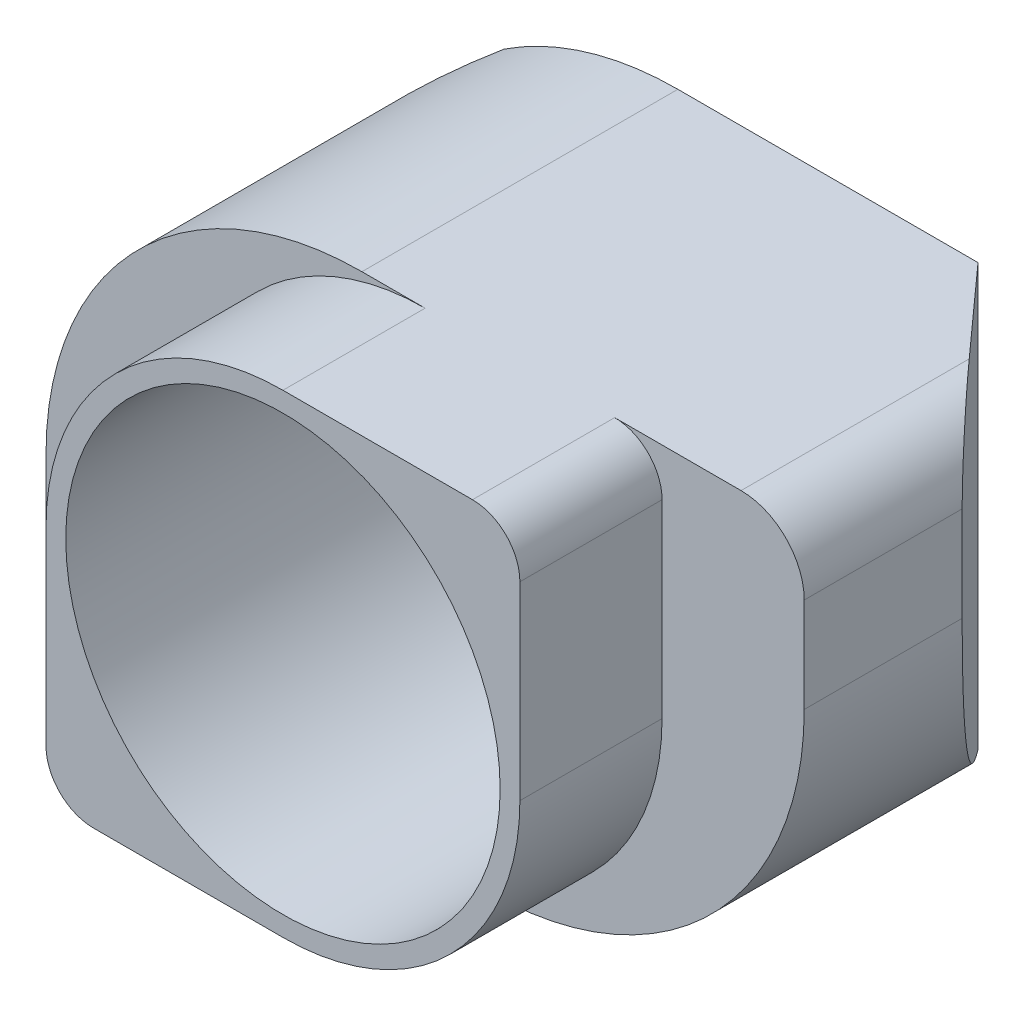
ISO-10303-21;
HEADER;
FILE_DESCRIPTION(('STEP AP214'),'2;1');
FILE_NAME('part.step','',(''),(''),'','','');
FILE_SCHEMA(('AUTOMOTIVE_DESIGN { 1 0 10303 214 1 1 1 1 }'));
ENDSEC;
DATA;
#1=APPLICATION_CONTEXT('core data for automotive mechanical design processes');
#2=APPLICATION_PROTOCOL_DEFINITION('international standard','automotive_design',2000,#1);
#3=PRODUCT_CONTEXT('',#1,'mechanical');
#4=PRODUCT('Part','Part','',(#3));
#5=PRODUCT_RELATED_PRODUCT_CATEGORY('part','',(#4));
#6=PRODUCT_DEFINITION_FORMATION('','',#4);
#7=PRODUCT_DEFINITION_CONTEXT('part definition',#1,'design');
#8=PRODUCT_DEFINITION('design','',#6,#7);
#9=PRODUCT_DEFINITION_SHAPE('','',#8);
#10=(LENGTH_UNIT() NAMED_UNIT(*) SI_UNIT(.MILLI.,.METRE.));
#11=(NAMED_UNIT(*) PLANE_ANGLE_UNIT() SI_UNIT($,.RADIAN.));
#12=(NAMED_UNIT(*) SI_UNIT($,.STERADIAN.) SOLID_ANGLE_UNIT());
#13=UNCERTAINTY_MEASURE_WITH_UNIT(LENGTH_MEASURE(1.E-05),#10,'distance_accuracy_value','');
#14=(GEOMETRIC_REPRESENTATION_CONTEXT(3) GLOBAL_UNCERTAINTY_ASSIGNED_CONTEXT((#13)) GLOBAL_UNIT_ASSIGNED_CONTEXT((#10,
#11,#12)) REPRESENTATION_CONTEXT('',''));
#15=CARTESIAN_POINT('',(0.,0.,0.));
#16=DIRECTION('',(0.,0.,1.));
#17=DIRECTION('',(1.,0.,0.));
#18=AXIS2_PLACEMENT_3D('',#15,#16,#17);
#19=CARTESIAN_POINT('',(0.,0.,4.));
#20=DIRECTION('',(0.,0.,1.));
#21=DIRECTION('',(1.,0.,0.));
#22=AXIS2_PLACEMENT_3D('',#19,#20,#21);
#23=PLANE('',#22);
#24=CARTESIAN_POINT('',(-4.,-2.2,4.));
#25=DIRECTION('',(0.,0.,-1.));
#26=DIRECTION('',(-0.707106781186548,-0.707106781186547,0.));
#27=AXIS2_PLACEMENT_3D('',#24,#25,#26);
#28=CIRCLE('',#27,0.8);
#29=CARTESIAN_POINT('',(-4.,-3.,4.));
#30=VERTEX_POINT('',#29);
#31=CARTESIAN_POINT('',(-4.8,-2.2,4.));
#32=VERTEX_POINT('',#31);
#33=EDGE_CURVE('E287',#30,#32,#28,.T.);
#34=ORIENTED_EDGE('',*,*,#33,.F.);
#35=DIRECTION('',(1.,0.,0.));
#36=VECTOR('',#35,1.);
#37=CARTESIAN_POINT('',(-4.8,-3.,4.));
#38=LINE('',#37,#36);
#39=CARTESIAN_POINT('',(-2.4,-3.,4.));
#40=VERTEX_POINT('',#39);
#41=EDGE_CURVE('E255',#30,#40,#38,.T.);
#42=ORIENTED_EDGE('',*,*,#41,.T.);
#43=CARTESIAN_POINT('',(-2.4,-2.4,4.));
#44=DIRECTION('',(0.,0.,1.));
#45=DIRECTION('',(-0.707106781186548,-0.707106781186547,0.));
#46=AXIS2_PLACEMENT_3D('',#43,#44,#45);
#47=CIRCLE('',#46,0.6);
#48=CARTESIAN_POINT('',(-3.,-2.4,4.));
#49=VERTEX_POINT('',#48);
#50=EDGE_CURVE('E256',#49,#40,#47,.T.);
#51=ORIENTED_EDGE('',*,*,#50,.F.);
#52=DIRECTION('',(0.,1.,0.));
#53=VECTOR('',#52,1.);
#54=CARTESIAN_POINT('',(-3.,0.,4.));
#55=LINE('',#54,#53);
#56=CARTESIAN_POINT('',(-3.,0.,4.));
#57=VERTEX_POINT('',#56);
#58=EDGE_CURVE('E50',#49,#57,#55,.T.);
#59=ORIENTED_EDGE('',*,*,#58,.T.);
#60=CARTESIAN_POINT('',(0.,0.,4.));
#61=DIRECTION('',(0.,0.,-1.));
#62=DIRECTION('',(-1.,0.,0.));
#63=AXIS2_PLACEMENT_3D('',#60,#61,#62);
#64=CIRCLE('',#63,3.);
#65=CARTESIAN_POINT('',(0.,3.,4.));
#66=VERTEX_POINT('',#65);
#67=EDGE_CURVE('E11',#57,#66,#64,.T.);
#68=ORIENTED_EDGE('',*,*,#67,.T.);
#69=DIRECTION('',(-1.,0.,0.));
#70=VECTOR('',#69,1.);
#71=CARTESIAN_POINT('',(4.8,3.,4.));
#72=LINE('',#71,#70);
#73=CARTESIAN_POINT('',(-0.8,3.,4.));
#74=VERTEX_POINT('',#73);
#75=EDGE_CURVE('E298',#66,#74,#72,.T.);
#76=ORIENTED_EDGE('',*,*,#75,.T.);
#77=CARTESIAN_POINT('',(-0.8,-1.,4.));
#78=DIRECTION('',(0.,0.,-1.));
#79=DIRECTION('',(-0.707106781186548,0.707106781186548,0.));
#80=AXIS2_PLACEMENT_3D('',#77,#78,#79);
#81=CIRCLE('',#80,4.);
#82=CARTESIAN_POINT('',(-4.8,-1.,4.));
#83=VERTEX_POINT('',#82);
#84=EDGE_CURVE('E306',#83,#74,#81,.T.);
#85=ORIENTED_EDGE('',*,*,#84,.F.);
#86=DIRECTION('',(0.,-1.,0.));
#87=VECTOR('',#86,1.);
#88=CARTESIAN_POINT('',(-4.8,3.,4.));
#89=LINE('',#88,#87);
#90=EDGE_CURVE('E269',#83,#32,#89,.T.);
#91=ORIENTED_EDGE('',*,*,#90,.T.);
#92=EDGE_LOOP('',(#34,#42,#51,#59,#68,#76,#85,#91));
#93=FACE_BOUND('',#92,.T.);
#94=ADVANCED_FACE('F40',(#93),#23,.T.);
#95=CARTESIAN_POINT('',(0.,0.,4.));
#96=DIRECTION('',(0.,0.,1.));
#97=DIRECTION('',(-1.,0.,0.));
#98=AXIS2_PLACEMENT_3D('',#95,#96,#97);
#99=CYLINDRICAL_SURFACE('',#98,3.);
#100=CARTESIAN_POINT('',(0.,0.,4.));
#101=DIRECTION('',(0.,0.,-1.));
#102=DIRECTION('',(-1.,0.,0.));
#103=AXIS2_PLACEMENT_3D('',#100,#101,#102);
#104=CIRCLE('',#103,3.);
#105=CARTESIAN_POINT('',(3.,0.,4.));
#106=VERTEX_POINT('',#105);
#107=CARTESIAN_POINT('',(0.,-3.,4.));
#108=VERTEX_POINT('',#107);
#109=EDGE_CURVE('E195',#106,#108,#104,.T.);
#110=ORIENTED_EDGE('',*,*,#109,.F.);
#111=DIRECTION('',(0.,0.,1.));
#112=VECTOR('',#111,1.);
#113=CARTESIAN_POINT('',(3.,0.,4.));
#114=LINE('',#113,#112);
#115=CARTESIAN_POINT('',(3.,0.,5.8));
#116=VERTEX_POINT('',#115);
#117=EDGE_CURVE('E262',#106,#116,#114,.T.);
#118=ORIENTED_EDGE('',*,*,#117,.T.);
#119=CARTESIAN_POINT('',(0.,0.,5.8));
#120=DIRECTION('',(0.,0.,1.));
#121=DIRECTION('',(-1.,0.,0.));
#122=AXIS2_PLACEMENT_3D('',#119,#120,#121);
#123=CIRCLE('',#122,3.);
#124=CARTESIAN_POINT('',(0.,-3.,5.8));
#125=VERTEX_POINT('',#124);
#126=EDGE_CURVE('E278',#125,#116,#123,.T.);
#127=ORIENTED_EDGE('',*,*,#126,.F.);
#128=DIRECTION('',(0.,0.,1.));
#129=VECTOR('',#128,1.);
#130=CARTESIAN_POINT('',(0.,-3.,4.));
#131=LINE('',#130,#129);
#132=EDGE_CURVE('E43',#108,#125,#131,.T.);
#133=ORIENTED_EDGE('',*,*,#132,.F.);
#134=EDGE_LOOP('',(#110,#118,#127,#133));
#135=FACE_BOUND('',#134,.T.);
#136=ADVANCED_FACE('F351',(#135),#99,.T.);
#137=CARTESIAN_POINT('',(0.,0.,4.));
#138=DIRECTION('',(0.,0.,1.));
#139=DIRECTION('',(-1.,0.,0.));
#140=AXIS2_PLACEMENT_3D('',#137,#138,#139);
#141=CYLINDRICAL_SURFACE('',#140,3.);
#142=ORIENTED_EDGE('',*,*,#67,.F.);
#143=DIRECTION('',(0.,0.,1.));
#144=VECTOR('',#143,1.);
#145=CARTESIAN_POINT('',(-3.,0.,4.));
#146=LINE('',#145,#144);
#147=CARTESIAN_POINT('',(-3.,0.,5.8));
#148=VERTEX_POINT('',#147);
#149=EDGE_CURVE('E300',#57,#148,#146,.T.);
#150=ORIENTED_EDGE('',*,*,#149,.T.);
#151=CARTESIAN_POINT('',(0.,0.,5.8));
#152=DIRECTION('',(0.,0.,1.));
#153=DIRECTION('',(-1.,0.,0.));
#154=AXIS2_PLACEMENT_3D('',#151,#152,#153);
#155=CIRCLE('',#154,3.);
#156=CARTESIAN_POINT('',(0.,3.,5.8));
#157=VERTEX_POINT('',#156);
#158=EDGE_CURVE('E236',#157,#148,#155,.T.);
#159=ORIENTED_EDGE('',*,*,#158,.F.);
#160=DIRECTION('',(0.,0.,1.));
#161=VECTOR('',#160,1.);
#162=CARTESIAN_POINT('',(0.,3.,4.));
#163=LINE('',#162,#161);
#164=EDGE_CURVE('E303',#66,#157,#163,.T.);
#165=ORIENTED_EDGE('',*,*,#164,.F.);
#166=EDGE_LOOP('',(#142,#150,#159,#165));
#167=FACE_BOUND('',#166,.T.);
#168=ADVANCED_FACE('F447',(#167),#141,.T.);
#169=CARTESIAN_POINT('',(-3.,0.,4.));
#170=DIRECTION('',(-1.,0.,0.));
#171=DIRECTION('',(0.,0.,1.));
#172=AXIS2_PLACEMENT_3D('',#169,#170,#171);
#173=PLANE('',#172);
#174=DIRECTION('',(0.,0.,-1.));
#175=VECTOR('',#174,1.);
#176=CARTESIAN_POINT('',(-3.,-2.4,2.));
#177=LINE('',#176,#175);
#178=CARTESIAN_POINT('',(-3.,-2.4,5.8));
#179=VERTEX_POINT('',#178);
#180=EDGE_CURVE('E274',#179,#49,#177,.T.);
#181=ORIENTED_EDGE('',*,*,#180,.F.);
#182=DIRECTION('',(0.,-1.,0.));
#183=VECTOR('',#182,1.);
#184=CARTESIAN_POINT('',(-3.,0.,5.8));
#185=LINE('',#184,#183);
#186=EDGE_CURVE('E323',#148,#179,#185,.T.);
#187=ORIENTED_EDGE('',*,*,#186,.F.);
#188=ORIENTED_EDGE('',*,*,#149,.F.);
#189=ORIENTED_EDGE('',*,*,#58,.F.);
#190=EDGE_LOOP('',(#181,#187,#188,#189));
#191=FACE_BOUND('',#190,.T.);
#192=ADVANCED_FACE('F445',(#191),#173,.T.);
#193=CARTESIAN_POINT('',(-4.8,3.,0.));
#194=DIRECTION('',(-1.,0.,0.));
#195=DIRECTION('',(0.,0.,1.));
#196=AXIS2_PLACEMENT_3D('',#193,#194,#195);
#197=PLANE('',#196);
#198=DIRECTION('',(0.,0.,-1.));
#199=VECTOR('',#198,1.);
#200=CARTESIAN_POINT('',(-4.8,-2.2,0.));
#201=LINE('',#200,#199);
#202=CARTESIAN_POINT('',(-4.8,-2.2,2.));
#203=VERTEX_POINT('',#202);
#204=EDGE_CURVE('E250',#32,#203,#201,.T.);
#205=ORIENTED_EDGE('',*,*,#204,.F.);
#206=ORIENTED_EDGE('',*,*,#90,.F.);
#207=DIRECTION('',(0.,0.,1.));
#208=VECTOR('',#207,1.);
#209=CARTESIAN_POINT('',(-4.8,-1.,0.));
#210=LINE('',#209,#208);
#211=CARTESIAN_POINT('',(-4.8,-1.,2.));
#212=VERTEX_POINT('',#211);
#213=EDGE_CURVE('E261',#212,#83,#210,.T.);
#214=ORIENTED_EDGE('',*,*,#213,.F.);
#215=DIRECTION('',(0.,-1.,0.));
#216=VECTOR('',#215,1.);
#217=CARTESIAN_POINT('',(-4.8,0.,2.));
#218=LINE('',#217,#216);
#219=EDGE_CURVE('E249',#212,#203,#218,.T.);
#220=ORIENTED_EDGE('',*,*,#219,.T.);
#221=EDGE_LOOP('',(#205,#206,#214,#220));
#222=FACE_BOUND('',#221,.T.);
#223=ADVANCED_FACE('F482',(#222),#197,.T.);
#224=CARTESIAN_POINT('',(3.,-3.,0.));
#225=DIRECTION('',(-0.743294146247166,0.,0.66896473162245));
#226=DIRECTION('',(0.,1.,0.));
#227=AXIS2_PLACEMENT_3D('',#224,#225,#226);
#228=PLANE('',#227);
#229=CARTESIAN_POINT('',(4.,2.2,1.11111111111111));
#230=DIRECTION('',(-0.743294146247166,0.,0.66896473162245));
#231=DIRECTION('',(0.66896473162245,0.,0.743294146247166));
#232=AXIS2_PLACEMENT_3D('',#229,#230,#231);
#233=ELLIPSE('',#232,1.19587769307322,0.8);
#234=CARTESIAN_POINT('',(4.8,2.2,2.));
#235=VERTEX_POINT('',#234);
#236=CARTESIAN_POINT('',(4.,3.,1.11111111111111));
#237=VERTEX_POINT('',#236);
#238=EDGE_CURVE('E203',#235,#237,#233,.T.);
#239=ORIENTED_EDGE('',*,*,#238,.F.);
#240=DIRECTION('',(0.,1.,0.));
#241=VECTOR('',#240,1.);
#242=CARTESIAN_POINT('',(4.8,-3.,2.));
#243=LINE('',#242,#241);
#244=CARTESIAN_POINT('',(4.8,1.,2.));
#245=VERTEX_POINT('',#244);
#246=EDGE_CURVE('E266',#245,#235,#243,.T.);
#247=ORIENTED_EDGE('',*,*,#246,.F.);
#248=CARTESIAN_POINT('',(0.8,1.,-2.44444444444445));
#249=DIRECTION('',(-0.743294146247166,0.,0.66896473162245));
#250=DIRECTION('',(0.66896473162245,0.,0.743294146247166));
#251=AXIS2_PLACEMENT_3D('',#248,#249,#250);
#252=ELLIPSE('',#251,5.97938846536609,4.);
#253=CARTESIAN_POINT('',(3.,-2.34065861769801,0.));
#254=VERTEX_POINT('',#253);
#255=EDGE_CURVE('E240',#254,#245,#252,.T.);
#256=ORIENTED_EDGE('',*,*,#255,.F.);
#257=DIRECTION('',(0.,-1.,0.));
#258=VECTOR('',#257,1.);
#259=CARTESIAN_POINT('',(3.,-1.5,0.));
#260=LINE('',#259,#258);
#261=CARTESIAN_POINT('',(3.,3.,0.));
#262=VERTEX_POINT('',#261);
#263=EDGE_CURVE('E257',#262,#254,#260,.T.);
#264=ORIENTED_EDGE('',*,*,#263,.F.);
#265=DIRECTION('',(-0.66896473162245,0.,-0.743294146247166));
#266=VECTOR('',#265,1.);
#267=CARTESIAN_POINT('',(3.40276243093923,3.,0.447513812154696));
#268=LINE('',#267,#266);
#269=EDGE_CURVE('E393',#237,#262,#268,.T.);
#270=ORIENTED_EDGE('',*,*,#269,.F.);
#271=EDGE_LOOP('',(#239,#247,#256,#264,#270));
#272=FACE_BOUND('',#271,.T.);
#273=ADVANCED_FACE('F477',(#272),#228,.F.);
#274=CARTESIAN_POINT('',(4.8,-3.,0.));
#275=DIRECTION('',(1.,0.,0.));
#276=DIRECTION('',(0.,1.,0.));
#277=AXIS2_PLACEMENT_3D('',#274,#275,#276);
#278=PLANE('',#277);
#279=DIRECTION('',(0.,0.,-1.));
#280=VECTOR('',#279,1.);
#281=CARTESIAN_POINT('',(4.8,2.2,0.));
#282=LINE('',#281,#280);
#283=CARTESIAN_POINT('',(4.8,2.2,4.));
#284=VERTEX_POINT('',#283);
#285=EDGE_CURVE('E212',#284,#235,#282,.T.);
#286=ORIENTED_EDGE('',*,*,#285,.F.);
#287=DIRECTION('',(0.,1.,0.));
#288=VECTOR('',#287,1.);
#289=CARTESIAN_POINT('',(4.8,-3.,4.));
#290=LINE('',#289,#288);
#291=CARTESIAN_POINT('',(4.8,1.,4.));
#292=VERTEX_POINT('',#291);
#293=EDGE_CURVE('E209',#292,#284,#290,.T.);
#294=ORIENTED_EDGE('',*,*,#293,.F.);
#295=DIRECTION('',(0.,0.,1.));
#296=VECTOR('',#295,1.);
#297=CARTESIAN_POINT('',(4.8,1.,0.));
#298=LINE('',#297,#296);
#299=EDGE_CURVE('E244',#245,#292,#298,.T.);
#300=ORIENTED_EDGE('',*,*,#299,.F.);
#301=ORIENTED_EDGE('',*,*,#246,.T.);
#302=EDGE_LOOP('',(#286,#294,#300,#301));
#303=FACE_BOUND('',#302,.T.);
#304=ADVANCED_FACE('F392',(#303),#278,.T.);
#305=CARTESIAN_POINT('',(0.8,1.,0.));
#306=DIRECTION('',(0.,0.,1.));
#307=DIRECTION('',(0.707106781186548,-0.707106781186548,0.));
#308=AXIS2_PLACEMENT_3D('',#305,#306,#307);
#309=CYLINDRICAL_SURFACE('',#308,4.);
#310=CARTESIAN_POINT('',(0.8,1.,4.));
#311=DIRECTION('',(0.,0.,-1.));
#312=DIRECTION('',(0.707106781186548,-0.707106781186548,0.));
#313=AXIS2_PLACEMENT_3D('',#310,#311,#312);
#314=CIRCLE('',#313,4.);
#315=CARTESIAN_POINT('',(0.8,-3.,4.));
#316=VERTEX_POINT('',#315);
#317=EDGE_CURVE('E237',#292,#316,#314,.T.);
#318=ORIENTED_EDGE('',*,*,#317,.T.);
#319=DIRECTION('',(0.,0.,-1.));
#320=VECTOR('',#319,1.);
#321=CARTESIAN_POINT('',(0.8,-3.,0.));
#322=LINE('',#321,#320);
#323=CARTESIAN_POINT('',(0.8,-3.,0.));
#324=VERTEX_POINT('',#323);
#325=EDGE_CURVE('E311',#316,#324,#322,.T.);
#326=ORIENTED_EDGE('',*,*,#325,.T.);
#327=CARTESIAN_POINT('',(0.8,1.,0.));
#328=DIRECTION('',(0.,0.,1.));
#329=DIRECTION('',(0.707106781186548,-0.707106781186548,0.));
#330=AXIS2_PLACEMENT_3D('',#327,#328,#329);
#331=CIRCLE('',#330,4.);
#332=EDGE_CURVE('E245',#324,#254,#331,.T.);
#333=ORIENTED_EDGE('',*,*,#332,.T.);
#334=ORIENTED_EDGE('',*,*,#255,.T.);
#335=ORIENTED_EDGE('',*,*,#299,.T.);
#336=EDGE_LOOP('',(#318,#326,#333,#334,#335));
#337=FACE_BOUND('',#336,.T.);
#338=ADVANCED_FACE('F389',(#337),#309,.T.);
#339=CARTESIAN_POINT('',(0.,0.,0.));
#340=DIRECTION('',(0.,0.,1.));
#341=DIRECTION('',(1.,0.,0.));
#342=AXIS2_PLACEMENT_3D('',#339,#340,#341);
#343=PLANE('',#342);
#344=CARTESIAN_POINT('',(0.,0.,0.));
#345=DIRECTION('',(0.,0.,1.));
#346=DIRECTION('',(1.,0.,0.));
#347=AXIS2_PLACEMENT_3D('',#344,#345,#346);
#348=CIRCLE('',#347,2.75);
#349=CARTESIAN_POINT('',(2.75,0.,0.));
#350=VERTEX_POINT('',#349);
#351=EDGE_CURVE('E231',#350,#350,#348,.T.);
#352=ORIENTED_EDGE('',*,*,#351,.T.);
#353=EDGE_LOOP('',(#352));
#354=FACE_BOUND('',#353,.T.);
#355=CARTESIAN_POINT('',(-0.8,-1.,0.));
#356=DIRECTION('',(0.,0.,1.));
#357=DIRECTION('',(-0.707106781186548,0.707106781186548,0.));
#358=AXIS2_PLACEMENT_3D('',#355,#356,#357);
#359=CIRCLE('',#358,4.);
#360=CARTESIAN_POINT('',(-0.8,3.,0.));
#361=VERTEX_POINT('',#360);
#362=CARTESIAN_POINT('',(-3.,2.34065861769801,0.));
#363=VERTEX_POINT('',#362);
#364=EDGE_CURVE('E410',#361,#363,#359,.T.);
#365=ORIENTED_EDGE('',*,*,#364,.F.);
#366=DIRECTION('',(-1.,0.,0.));
#367=VECTOR('',#366,1.);
#368=CARTESIAN_POINT('',(4.8,3.,0.));
#369=LINE('',#368,#367);
#370=EDGE_CURVE('E299',#262,#361,#369,.T.);
#371=ORIENTED_EDGE('',*,*,#370,.F.);
#372=ORIENTED_EDGE('',*,*,#263,.T.);
#373=ORIENTED_EDGE('',*,*,#332,.F.);
#374=DIRECTION('',(1.,0.,0.));
#375=VECTOR('',#374,1.);
#376=CARTESIAN_POINT('',(-4.8,-3.,0.));
#377=LINE('',#376,#375);
#378=CARTESIAN_POINT('',(-3.,-3.,0.));
#379=VERTEX_POINT('',#378);
#380=EDGE_CURVE('E307',#379,#324,#377,.T.);
#381=ORIENTED_EDGE('',*,*,#380,.F.);
#382=DIRECTION('',(0.,1.,0.));
#383=VECTOR('',#382,1.);
#384=CARTESIAN_POINT('',(-3.,-1.5,0.));
#385=LINE('',#384,#383);
#386=EDGE_CURVE('E213',#379,#363,#385,.T.);
#387=ORIENTED_EDGE('',*,*,#386,.T.);
#388=EDGE_LOOP('',(#365,#371,#372,#373,#381,#387));
#389=FACE_BOUND('',#388,.T.);
#390=ADVANCED_FACE('F385',(#354,#389),#343,.F.);
#391=CARTESIAN_POINT('',(-0.8,-1.,0.));
#392=DIRECTION('',(0.,0.,1.));
#393=DIRECTION('',(-0.707106781186548,0.707106781186548,0.));
#394=AXIS2_PLACEMENT_3D('',#391,#392,#393);
#395=CYLINDRICAL_SURFACE('',#394,4.);
#396=ORIENTED_EDGE('',*,*,#84,.T.);
#397=DIRECTION('',(0.,0.,-1.));
#398=VECTOR('',#397,1.);
#399=CARTESIAN_POINT('',(-0.8,3.,0.));
#400=LINE('',#399,#398);
#401=EDGE_CURVE('E294',#74,#361,#400,.T.);
#402=ORIENTED_EDGE('',*,*,#401,.T.);
#403=ORIENTED_EDGE('',*,*,#364,.T.);
#404=CARTESIAN_POINT('',(-0.8,-1.,-2.44444444444445));
#405=DIRECTION('',(0.743294146247166,0.,0.66896473162245));
#406=DIRECTION('',(-0.66896473162245,0.,0.743294146247166));
#407=AXIS2_PLACEMENT_3D('',#404,#405,#406);
#408=ELLIPSE('',#407,5.97938846536609,4.);
#409=EDGE_CURVE('E220',#363,#212,#408,.T.);
#410=ORIENTED_EDGE('',*,*,#409,.T.);
#411=ORIENTED_EDGE('',*,*,#213,.T.);
#412=EDGE_LOOP('',(#396,#402,#403,#410,#411));
#413=FACE_BOUND('',#412,.T.);
#414=ADVANCED_FACE('F416',(#413),#395,.T.);
#415=CARTESIAN_POINT('',(4.8,3.,0.));
#416=DIRECTION('',(0.,1.,0.));
#417=DIRECTION('',(1.,0.,0.));
#418=AXIS2_PLACEMENT_3D('',#415,#416,#417);
#419=PLANE('',#418);
#420=DIRECTION('',(-1.,0.,0.));
#421=VECTOR('',#420,1.);
#422=CARTESIAN_POINT('',(4.8,3.,4.));
#423=LINE('',#422,#421);
#424=CARTESIAN_POINT('',(4.,3.,4.));
#425=VERTEX_POINT('',#424);
#426=CARTESIAN_POINT('',(2.4,3.,4.));
#427=VERTEX_POINT('',#426);
#428=EDGE_CURVE('E178',#425,#427,#423,.T.);
#429=ORIENTED_EDGE('',*,*,#428,.F.);
#430=DIRECTION('',(0.,0.,1.));
#431=VECTOR('',#430,1.);
#432=CARTESIAN_POINT('',(4.,3.,0.));
#433=LINE('',#432,#431);
#434=EDGE_CURVE('E189',#237,#425,#433,.T.);
#435=ORIENTED_EDGE('',*,*,#434,.F.);
#436=ORIENTED_EDGE('',*,*,#269,.T.);
#437=ORIENTED_EDGE('',*,*,#370,.T.);
#438=ORIENTED_EDGE('',*,*,#401,.F.);
#439=ORIENTED_EDGE('',*,*,#75,.F.);
#440=ORIENTED_EDGE('',*,*,#164,.T.);
#441=DIRECTION('',(-1.,0.,0.));
#442=VECTOR('',#441,1.);
#443=CARTESIAN_POINT('',(3.,3.,5.8));
#444=LINE('',#443,#442);
#445=CARTESIAN_POINT('',(2.4,3.,5.8));
#446=VERTEX_POINT('',#445);
#447=EDGE_CURVE('E232',#446,#157,#444,.T.);
#448=ORIENTED_EDGE('',*,*,#447,.F.);
#449=DIRECTION('',(0.,0.,1.));
#450=VECTOR('',#449,1.);
#451=CARTESIAN_POINT('',(2.4,3.,2.));
#452=LINE('',#451,#450);
#453=EDGE_CURVE('E192',#427,#446,#452,.T.);
#454=ORIENTED_EDGE('',*,*,#453,.F.);
#455=EDGE_LOOP('',(#429,#435,#436,#437,#438,#439,#440,#448,#454));
#456=FACE_BOUND('',#455,.T.);
#457=ADVANCED_FACE('F187',(#456),#419,.T.);
#458=CARTESIAN_POINT('',(0.,0.,4.));
#459=DIRECTION('',(0.,0.,1.));
#460=DIRECTION('',(1.,0.,0.));
#461=AXIS2_PLACEMENT_3D('',#458,#459,#460);
#462=PLANE('',#461);
#463=CARTESIAN_POINT('',(4.,2.2,4.));
#464=DIRECTION('',(0.,0.,-1.));
#465=DIRECTION('',(0.707106781186548,0.707106781186547,0.));
#466=AXIS2_PLACEMENT_3D('',#463,#464,#465);
#467=CIRCLE('',#466,0.8);
#468=EDGE_CURVE('E201',#425,#284,#467,.T.);
#469=ORIENTED_EDGE('',*,*,#468,.F.);
#470=ORIENTED_EDGE('',*,*,#428,.T.);
#471=CARTESIAN_POINT('',(2.4,2.4,4.));
#472=DIRECTION('',(0.,0.,1.));
#473=DIRECTION('',(0.707106781186548,0.707106781186547,0.));
#474=AXIS2_PLACEMENT_3D('',#471,#472,#473);
#475=CIRCLE('',#474,0.6);
#476=CARTESIAN_POINT('',(3.,2.4,4.));
#477=VERTEX_POINT('',#476);
#478=EDGE_CURVE('E315',#477,#427,#475,.T.);
#479=ORIENTED_EDGE('',*,*,#478,.F.);
#480=DIRECTION('',(0.,-1.,0.));
#481=VECTOR('',#480,1.);
#482=CARTESIAN_POINT('',(3.,0.,4.));
#483=LINE('',#482,#481);
#484=EDGE_CURVE('E169',#477,#106,#483,.T.);
#485=ORIENTED_EDGE('',*,*,#484,.T.);
#486=ORIENTED_EDGE('',*,*,#109,.T.);
#487=DIRECTION('',(1.,0.,0.));
#488=VECTOR('',#487,1.);
#489=CARTESIAN_POINT('',(-4.8,-3.,4.));
#490=LINE('',#489,#488);
#491=EDGE_CURVE('E357',#108,#316,#490,.T.);
#492=ORIENTED_EDGE('',*,*,#491,.T.);
#493=ORIENTED_EDGE('',*,*,#317,.F.);
#494=ORIENTED_EDGE('',*,*,#293,.T.);
#495=EDGE_LOOP('',(#469,#470,#479,#485,#486,#492,#493,#494));
#496=FACE_BOUND('',#495,.T.);
#497=ADVANCED_FACE('F206',(#496),#462,.T.);
#498=CARTESIAN_POINT('',(4.,2.2,0.));
#499=DIRECTION('',(0.,0.,1.));
#500=DIRECTION('',(0.707106781186548,0.707106781186547,0.));
#501=AXIS2_PLACEMENT_3D('',#498,#499,#500);
#502=CYLINDRICAL_SURFACE('',#501,0.8);
#503=ORIENTED_EDGE('',*,*,#468,.T.);
#504=ORIENTED_EDGE('',*,*,#285,.T.);
#505=ORIENTED_EDGE('',*,*,#238,.T.);
#506=ORIENTED_EDGE('',*,*,#434,.T.);
#507=EDGE_LOOP('',(#503,#504,#505,#506));
#508=FACE_BOUND('',#507,.T.);
#509=ADVANCED_FACE('F199',(#508),#502,.T.);
#510=CARTESIAN_POINT('',(-4.8,-3.,2.));
#511=DIRECTION('',(0.743294146247166,0.,0.66896473162245));
#512=DIRECTION('',(0.,-1.,0.));
#513=AXIS2_PLACEMENT_3D('',#510,#511,#512);
#514=PLANE('',#513);
#515=CARTESIAN_POINT('',(-4.,-2.2,1.11111111111111));
#516=DIRECTION('',(0.743294146247166,0.,0.66896473162245));
#517=DIRECTION('',(-0.66896473162245,0.,0.743294146247166));
#518=AXIS2_PLACEMENT_3D('',#515,#516,#517);
#519=ELLIPSE('',#518,1.19587769307322,0.8);
#520=CARTESIAN_POINT('',(-4.,-3.,1.11111111111111));
#521=VERTEX_POINT('',#520);
#522=EDGE_CURVE('E246',#203,#521,#519,.T.);
#523=ORIENTED_EDGE('',*,*,#522,.F.);
#524=ORIENTED_EDGE('',*,*,#219,.F.);
#525=ORIENTED_EDGE('',*,*,#409,.F.);
#526=ORIENTED_EDGE('',*,*,#386,.F.);
#527=DIRECTION('',(0.66896473162245,0.,-0.743294146247166));
#528=VECTOR('',#527,1.);
#529=CARTESIAN_POINT('',(-4.30276243093923,-3.,1.4475138121547));
#530=LINE('',#529,#528);
#531=EDGE_CURVE('E282',#521,#379,#530,.T.);
#532=ORIENTED_EDGE('',*,*,#531,.F.);
#533=EDGE_LOOP('',(#523,#524,#525,#526,#532));
#534=FACE_BOUND('',#533,.T.);
#535=ADVANCED_FACE('F379',(#534),#514,.F.);
#536=CARTESIAN_POINT('',(-4.,-2.2,0.));
#537=DIRECTION('',(0.,0.,1.));
#538=DIRECTION('',(-0.707106781186548,-0.707106781186547,0.));
#539=AXIS2_PLACEMENT_3D('',#536,#537,#538);
#540=CYLINDRICAL_SURFACE('',#539,0.8);
#541=ORIENTED_EDGE('',*,*,#33,.T.);
#542=ORIENTED_EDGE('',*,*,#204,.T.);
#543=ORIENTED_EDGE('',*,*,#522,.T.);
#544=DIRECTION('',(0.,0.,1.));
#545=VECTOR('',#544,1.);
#546=CARTESIAN_POINT('',(-4.,-3.,0.));
#547=LINE('',#546,#545);
#548=EDGE_CURVE('E279',#521,#30,#547,.T.);
#549=ORIENTED_EDGE('',*,*,#548,.T.);
#550=EDGE_LOOP('',(#541,#542,#543,#549));
#551=FACE_BOUND('',#550,.T.);
#552=ADVANCED_FACE('F438',(#551),#540,.T.);
#553=CARTESIAN_POINT('',(-4.8,-3.,0.));
#554=DIRECTION('',(0.,-1.,0.));
#555=DIRECTION('',(0.,0.,-1.));
#556=AXIS2_PLACEMENT_3D('',#553,#554,#555);
#557=PLANE('',#556);
#558=DIRECTION('',(0.,0.,1.));
#559=VECTOR('',#558,1.);
#560=CARTESIAN_POINT('',(-2.4,-3.,2.));
#561=LINE('',#560,#559);
#562=CARTESIAN_POINT('',(-2.4,-3.,5.8));
#563=VERTEX_POINT('',#562);
#564=EDGE_CURVE('E251',#40,#563,#561,.T.);
#565=ORIENTED_EDGE('',*,*,#564,.F.);
#566=ORIENTED_EDGE('',*,*,#41,.F.);
#567=ORIENTED_EDGE('',*,*,#548,.F.);
#568=ORIENTED_EDGE('',*,*,#531,.T.);
#569=ORIENTED_EDGE('',*,*,#380,.T.);
#570=ORIENTED_EDGE('',*,*,#325,.F.);
#571=ORIENTED_EDGE('',*,*,#491,.F.);
#572=ORIENTED_EDGE('',*,*,#132,.T.);
#573=DIRECTION('',(1.,0.,0.));
#574=VECTOR('',#573,1.);
#575=CARTESIAN_POINT('',(-3.,-3.,5.8));
#576=LINE('',#575,#574);
#577=EDGE_CURVE('E336',#563,#125,#576,.T.);
#578=ORIENTED_EDGE('',*,*,#577,.F.);
#579=EDGE_LOOP('',(#565,#566,#567,#568,#569,#570,#571,#572,#578));
#580=FACE_BOUND('',#579,.T.);
#581=ADVANCED_FACE('F360',(#580),#557,.T.);
#582=CARTESIAN_POINT('',(-2.4,-2.4,2.));
#583=DIRECTION('',(0.,0.,1.));
#584=DIRECTION('',(-0.707106781186548,-0.707106781186547,0.));
#585=AXIS2_PLACEMENT_3D('',#582,#583,#584);
#586=CYLINDRICAL_SURFACE('',#585,0.6);
#587=CARTESIAN_POINT('',(-2.4,-2.4,5.8));
#588=DIRECTION('',(0.,0.,-1.));
#589=DIRECTION('',(-0.707106781186548,-0.707106781186547,0.));
#590=AXIS2_PLACEMENT_3D('',#587,#588,#589);
#591=CIRCLE('',#590,0.6);
#592=EDGE_CURVE('E332',#563,#179,#591,.T.);
#593=ORIENTED_EDGE('',*,*,#592,.T.);
#594=ORIENTED_EDGE('',*,*,#180,.T.);
#595=ORIENTED_EDGE('',*,*,#50,.T.);
#596=ORIENTED_EDGE('',*,*,#564,.T.);
#597=EDGE_LOOP('',(#593,#594,#595,#596));
#598=FACE_BOUND('',#597,.T.);
#599=ADVANCED_FACE('F441',(#598),#586,.T.);
#600=CARTESIAN_POINT('',(0.,0.,5.8));
#601=DIRECTION('',(0.,0.,1.));
#602=DIRECTION('',(1.,0.,0.));
#603=AXIS2_PLACEMENT_3D('',#600,#601,#602);
#604=PLANE('',#603);
#605=CARTESIAN_POINT('',(0.,0.,5.8));
#606=DIRECTION('',(0.,0.,1.));
#607=DIRECTION('',(1.,0.,0.));
#608=AXIS2_PLACEMENT_3D('',#605,#606,#607);
#609=CIRCLE('',#608,2.75);
#610=CARTESIAN_POINT('',(2.75,0.,5.8));
#611=VERTEX_POINT('',#610);
#612=EDGE_CURVE('E508',#611,#611,#609,.T.);
#613=ORIENTED_EDGE('',*,*,#612,.F.);
#614=EDGE_LOOP('',(#613));
#615=FACE_BOUND('',#614,.T.);
#616=CARTESIAN_POINT('',(2.4,2.4,5.8));
#617=DIRECTION('',(0.,0.,-1.));
#618=DIRECTION('',(0.707106781186548,0.707106781186547,0.));
#619=AXIS2_PLACEMENT_3D('',#616,#617,#618);
#620=CIRCLE('',#619,0.6);
#621=CARTESIAN_POINT('',(3.,2.4,5.8));
#622=VERTEX_POINT('',#621);
#623=EDGE_CURVE('E226',#446,#622,#620,.T.);
#624=ORIENTED_EDGE('',*,*,#623,.F.);
#625=ORIENTED_EDGE('',*,*,#447,.T.);
#626=ORIENTED_EDGE('',*,*,#158,.T.);
#627=ORIENTED_EDGE('',*,*,#186,.T.);
#628=ORIENTED_EDGE('',*,*,#592,.F.);
#629=ORIENTED_EDGE('',*,*,#577,.T.);
#630=ORIENTED_EDGE('',*,*,#126,.T.);
#631=DIRECTION('',(0.,1.,0.));
#632=VECTOR('',#631,1.);
#633=CARTESIAN_POINT('',(3.,0.,5.8));
#634=LINE('',#633,#632);
#635=EDGE_CURVE('E224',#116,#622,#634,.T.);
#636=ORIENTED_EDGE('',*,*,#635,.T.);
#637=EDGE_LOOP('',(#624,#625,#626,#627,#628,#629,#630,#636));
#638=FACE_BOUND('',#637,.T.);
#639=ADVANCED_FACE('F450',(#615,#638),#604,.T.);
#640=CARTESIAN_POINT('',(3.,0.,4.));
#641=DIRECTION('',(1.,0.,0.));
#642=DIRECTION('',(0.,1.,0.));
#643=AXIS2_PLACEMENT_3D('',#640,#641,#642);
#644=PLANE('',#643);
#645=DIRECTION('',(0.,0.,-1.));
#646=VECTOR('',#645,1.);
#647=CARTESIAN_POINT('',(3.,2.4,2.));
#648=LINE('',#647,#646);
#649=EDGE_CURVE('E230',#622,#477,#648,.T.);
#650=ORIENTED_EDGE('',*,*,#649,.F.);
#651=ORIENTED_EDGE('',*,*,#635,.F.);
#652=ORIENTED_EDGE('',*,*,#117,.F.);
#653=ORIENTED_EDGE('',*,*,#484,.F.);
#654=EDGE_LOOP('',(#650,#651,#652,#653));
#655=FACE_BOUND('',#654,.T.);
#656=ADVANCED_FACE('F348',(#655),#644,.T.);
#657=CARTESIAN_POINT('',(2.4,2.4,2.));
#658=DIRECTION('',(0.,0.,1.));
#659=DIRECTION('',(0.707106781186548,0.707106781186547,0.));
#660=AXIS2_PLACEMENT_3D('',#657,#658,#659);
#661=CYLINDRICAL_SURFACE('',#660,0.6);
#662=ORIENTED_EDGE('',*,*,#623,.T.);
#663=ORIENTED_EDGE('',*,*,#649,.T.);
#664=ORIENTED_EDGE('',*,*,#478,.T.);
#665=ORIENTED_EDGE('',*,*,#453,.T.);
#666=EDGE_LOOP('',(#662,#663,#664,#665));
#667=FACE_BOUND('',#666,.T.);
#668=ADVANCED_FACE('F452',(#667),#661,.T.);
#669=CARTESIAN_POINT('',(0.,0.,-4.2));
#670=DIRECTION('',(0.,0.,1.));
#671=DIRECTION('',(1.,0.,0.));
#672=AXIS2_PLACEMENT_3D('',#669,#670,#671);
#673=CYLINDRICAL_SURFACE('',#672,2.75);
#674=ORIENTED_EDGE('',*,*,#612,.T.);
#675=EDGE_LOOP('',(#674));
#676=FACE_BOUND('',#675,.T.);
#677=ORIENTED_EDGE('',*,*,#351,.F.);
#678=EDGE_LOOP('',(#677));
#679=FACE_BOUND('',#678,.T.);
#680=ADVANCED_FACE('F455',(#676,#679),#673,.F.);
#681=CLOSED_SHELL('',(#94,#136,#168,#192,#223,#273,#304,#338,#390,#414,#457,#497,#509,#535,#552,
#581,#599,#639,#656,#668,#680));
#682=MANIFOLD_SOLID_BREP('B2',#681);
#683=ADVANCED_BREP_SHAPE_REPRESENTATION('',(#18,#682),#14);
#684=SHAPE_DEFINITION_REPRESENTATION(#9,#683);
ENDSEC;
END-ISO-10303-21;
